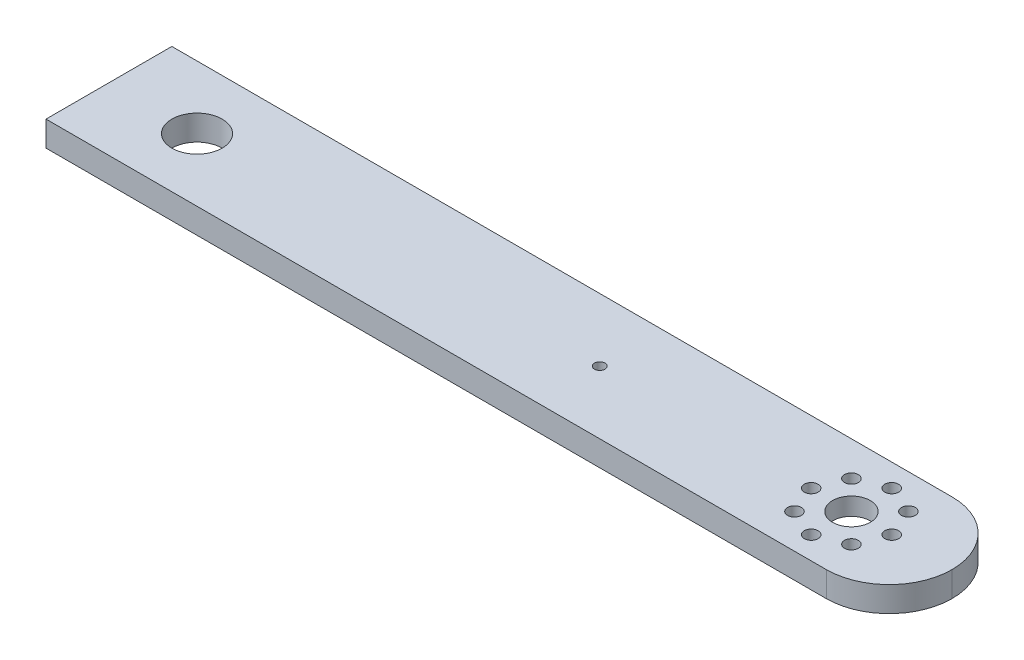
ISO-10303-21;
HEADER;
FILE_DESCRIPTION(('STEP AP214'),'2;1');
FILE_NAME('part.step','',(''),(''),'','','');
FILE_SCHEMA(('AUTOMOTIVE_DESIGN { 1 0 10303 214 1 1 1 1 }'));
ENDSEC;
DATA;
#1=APPLICATION_CONTEXT('core data for automotive mechanical design processes');
#2=APPLICATION_PROTOCOL_DEFINITION('international standard','automotive_design',2000,#1);
#3=PRODUCT_CONTEXT('',#1,'mechanical');
#4=PRODUCT('Part','Part','',(#3));
#5=PRODUCT_RELATED_PRODUCT_CATEGORY('part','',(#4));
#6=PRODUCT_DEFINITION_FORMATION('','',#4);
#7=PRODUCT_DEFINITION_CONTEXT('part definition',#1,'design');
#8=PRODUCT_DEFINITION('design','',#6,#7);
#9=PRODUCT_DEFINITION_SHAPE('','',#8);
#10=(LENGTH_UNIT() NAMED_UNIT(*) SI_UNIT(.MILLI.,.METRE.));
#11=(NAMED_UNIT(*) PLANE_ANGLE_UNIT() SI_UNIT($,.RADIAN.));
#12=(NAMED_UNIT(*) SI_UNIT($,.STERADIAN.) SOLID_ANGLE_UNIT());
#13=UNCERTAINTY_MEASURE_WITH_UNIT(LENGTH_MEASURE(1.E-05),#10,'distance_accuracy_value','');
#14=(GEOMETRIC_REPRESENTATION_CONTEXT(3) GLOBAL_UNCERTAINTY_ASSIGNED_CONTEXT((#13)) GLOBAL_UNIT_ASSIGNED_CONTEXT((#10,
#11,#12)) REPRESENTATION_CONTEXT('',''));
#15=CARTESIAN_POINT('',(0.,0.,0.));
#16=DIRECTION('',(0.,0.,1.));
#17=DIRECTION('',(1.,0.,0.));
#18=AXIS2_PLACEMENT_3D('',#15,#16,#17);
#19=CARTESIAN_POINT('',(0.,5.,0.));
#20=DIRECTION('',(0.,-1.,0.));
#21=DIRECTION('',(0.,0.,-1.));
#22=AXIS2_PLACEMENT_3D('',#19,#20,#21);
#23=CYLINDRICAL_SURFACE('',#22,7.5);
#24=CARTESIAN_POINT('',(0.,5.,0.));
#25=DIRECTION('',(0.,1.,0.));
#26=DIRECTION('',(0.,0.,1.));
#27=AXIS2_PLACEMENT_3D('',#24,#25,#26);
#28=CIRCLE('',#27,7.5);
#29=CARTESIAN_POINT('',(0.,5.,7.5));
#30=VERTEX_POINT('',#29);
#31=EDGE_CURVE('E194',#30,#30,#28,.T.);
#32=ORIENTED_EDGE('',*,*,#31,.T.);
#33=EDGE_LOOP('',(#32));
#34=FACE_BOUND('',#33,.T.);
#35=CARTESIAN_POINT('',(0.,-2.,0.));
#36=DIRECTION('',(0.,-1.,0.));
#37=DIRECTION('',(0.,0.,-1.));
#38=AXIS2_PLACEMENT_3D('',#35,#36,#37);
#39=CIRCLE('',#38,7.5);
#40=CARTESIAN_POINT('',(0.,-2.,-7.5));
#41=VERTEX_POINT('',#40);
#42=EDGE_CURVE('E229',#41,#41,#39,.T.);
#43=ORIENTED_EDGE('',*,*,#42,.T.);
#44=EDGE_LOOP('',(#43));
#45=FACE_BOUND('',#44,.T.);
#46=ADVANCED_FACE('F36',(#34,#45),#23,.F.);
#47=CARTESIAN_POINT('',(-16.,-5.,0.));
#48=DIRECTION('',(0.,1.,0.));
#49=DIRECTION('',(0.,0.,1.));
#50=AXIS2_PLACEMENT_3D('',#47,#48,#49);
#51=CYLINDRICAL_SURFACE('',#50,2.75);
#52=CARTESIAN_POINT('',(-16.,5.,0.));
#53=DIRECTION('',(0.,1.,0.));
#54=DIRECTION('',(0.,0.,1.));
#55=AXIS2_PLACEMENT_3D('',#52,#53,#54);
#56=CIRCLE('',#55,2.75);
#57=CARTESIAN_POINT('',(-16.,5.,2.75));
#58=VERTEX_POINT('',#57);
#59=EDGE_CURVE('E201',#58,#58,#56,.T.);
#60=ORIENTED_EDGE('',*,*,#59,.T.);
#61=EDGE_LOOP('',(#60));
#62=FACE_BOUND('',#61,.T.);
#63=CARTESIAN_POINT('',(-16.,-2.,0.));
#64=DIRECTION('',(0.,-1.,0.));
#65=DIRECTION('',(0.,0.,-1.));
#66=AXIS2_PLACEMENT_3D('',#63,#64,#65);
#67=CIRCLE('',#66,2.75);
#68=CARTESIAN_POINT('',(-16.,-2.,-2.75));
#69=VERTEX_POINT('',#68);
#70=EDGE_CURVE('E234',#69,#69,#67,.F.);
#71=ORIENTED_EDGE('',*,*,#70,.F.);
#72=EDGE_LOOP('',(#71));
#73=FACE_BOUND('',#72,.T.);
#74=ADVANCED_FACE('F143',(#62,#73),#51,.F.);
#75=CARTESIAN_POINT('',(-11.3137084989847,-5.,-11.3137084989848));
#76=DIRECTION('',(0.,1.,0.));
#77=DIRECTION('',(0.,0.,1.));
#78=AXIS2_PLACEMENT_3D('',#75,#76,#77);
#79=CYLINDRICAL_SURFACE('',#78,2.75);
#80=CARTESIAN_POINT('',(-11.3137084989847,5.,-11.3137084989848));
#81=DIRECTION('',(0.,1.,0.));
#82=DIRECTION('',(-0.707106781186549,0.,0.707106781186546));
#83=AXIS2_PLACEMENT_3D('',#80,#81,#82);
#84=CIRCLE('',#83,2.75);
#85=CARTESIAN_POINT('',(-13.2582521472477,5.,-9.36916485072178));
#86=VERTEX_POINT('',#85);
#87=EDGE_CURVE('E206',#86,#86,#84,.T.);
#88=ORIENTED_EDGE('',*,*,#87,.T.);
#89=EDGE_LOOP('',(#88));
#90=FACE_BOUND('',#89,.T.);
#91=CARTESIAN_POINT('',(-11.3137084989847,-2.,-11.3137084989848));
#92=DIRECTION('',(0.,-1.,0.));
#93=DIRECTION('',(0.,0.,-1.));
#94=AXIS2_PLACEMENT_3D('',#91,#92,#93);
#95=CIRCLE('',#94,2.75);
#96=CARTESIAN_POINT('',(-11.3137084989847,-2.,-14.0637084989848));
#97=VERTEX_POINT('',#96);
#98=EDGE_CURVE('E237',#97,#97,#95,.F.);
#99=ORIENTED_EDGE('',*,*,#98,.F.);
#100=EDGE_LOOP('',(#99));
#101=FACE_BOUND('',#100,.T.);
#102=ADVANCED_FACE('F149',(#90,#101),#79,.F.);
#103=CARTESIAN_POINT('',(-11.3137084989849,-5.,11.3137084989846));
#104=DIRECTION('',(0.,1.,0.));
#105=DIRECTION('',(0.,0.,1.));
#106=AXIS2_PLACEMENT_3D('',#103,#104,#105);
#107=CYLINDRICAL_SURFACE('',#106,2.75);
#108=CARTESIAN_POINT('',(-11.3137084989849,5.,11.3137084989846));
#109=DIRECTION('',(0.,1.,0.));
#110=DIRECTION('',(0.707106781186539,0.,0.707106781186556));
#111=AXIS2_PLACEMENT_3D('',#108,#109,#110);
#112=CIRCLE('',#111,2.75);
#113=CARTESIAN_POINT('',(-9.36916485072192,5.,13.2582521472477));
#114=VERTEX_POINT('',#113);
#115=EDGE_CURVE('E122',#114,#114,#112,.T.);
#116=ORIENTED_EDGE('',*,*,#115,.T.);
#117=EDGE_LOOP('',(#116));
#118=FACE_BOUND('',#117,.T.);
#119=CARTESIAN_POINT('',(-11.3137084989849,-2.,11.3137084989846));
#120=DIRECTION('',(0.,-1.,0.));
#121=DIRECTION('',(0.,0.,-1.));
#122=AXIS2_PLACEMENT_3D('',#119,#120,#121);
#123=CIRCLE('',#122,2.75);
#124=CARTESIAN_POINT('',(-11.3137084989849,-2.,8.56370849898462));
#125=VERTEX_POINT('',#124);
#126=EDGE_CURVE('E240',#125,#125,#123,.F.);
#127=ORIENTED_EDGE('',*,*,#126,.F.);
#128=EDGE_LOOP('',(#127));
#129=FACE_BOUND('',#128,.T.);
#130=ADVANCED_FACE('F279',(#118,#129),#107,.F.);
#131=CARTESIAN_POINT('',(-1.6759110426447E-13,-5.,16.));
#132=DIRECTION('',(0.,1.,0.));
#133=DIRECTION('',(0.,0.,1.));
#134=AXIS2_PLACEMENT_3D('',#131,#132,#133);
#135=CYLINDRICAL_SURFACE('',#134,2.75);
#136=CARTESIAN_POINT('',(-1.6759110426447E-13,5.,16.));
#137=DIRECTION('',(0.,1.,0.));
#138=DIRECTION('',(1.,0.,0.));
#139=AXIS2_PLACEMENT_3D('',#136,#137,#138);
#140=CIRCLE('',#139,2.75);
#141=CARTESIAN_POINT('',(2.74999999999983,5.,16.));
#142=VERTEX_POINT('',#141);
#143=EDGE_CURVE('E214',#142,#142,#140,.T.);
#144=ORIENTED_EDGE('',*,*,#143,.T.);
#145=EDGE_LOOP('',(#144));
#146=FACE_BOUND('',#145,.T.);
#147=CARTESIAN_POINT('',(-1.6759110426447E-13,-2.,16.));
#148=DIRECTION('',(0.,-1.,0.));
#149=DIRECTION('',(0.,0.,-1.));
#150=AXIS2_PLACEMENT_3D('',#147,#148,#149);
#151=CIRCLE('',#150,2.75);
#152=CARTESIAN_POINT('',(-1.6759110426447E-13,-2.,13.25));
#153=VERTEX_POINT('',#152);
#154=EDGE_CURVE('E243',#153,#153,#151,.F.);
#155=ORIENTED_EDGE('',*,*,#154,.F.);
#156=EDGE_LOOP('',(#155));
#157=FACE_BOUND('',#156,.T.);
#158=ADVANCED_FACE('F285',(#146,#157),#135,.F.);
#159=CARTESIAN_POINT('',(11.3137084989847,-5.,11.3137084989849));
#160=DIRECTION('',(0.,1.,0.));
#161=DIRECTION('',(0.,0.,1.));
#162=AXIS2_PLACEMENT_3D('',#159,#160,#161);
#163=CYLINDRICAL_SURFACE('',#162,2.75);
#164=CARTESIAN_POINT('',(11.3137084989847,5.,11.3137084989849));
#165=DIRECTION('',(0.,1.,0.));
#166=DIRECTION('',(0.707106781186554,0.,-0.707106781186541));
#167=AXIS2_PLACEMENT_3D('',#164,#165,#166);
#168=CIRCLE('',#167,2.75);
#169=CARTESIAN_POINT('',(13.2582521472477,5.,9.36916485072187));
#170=VERTEX_POINT('',#169);
#171=EDGE_CURVE('E210',#170,#170,#168,.T.);
#172=ORIENTED_EDGE('',*,*,#171,.T.);
#173=EDGE_LOOP('',(#172));
#174=FACE_BOUND('',#173,.T.);
#175=CARTESIAN_POINT('',(11.3137084989847,-2.,11.3137084989849));
#176=DIRECTION('',(0.,-1.,0.));
#177=DIRECTION('',(0.,0.,-1.));
#178=AXIS2_PLACEMENT_3D('',#175,#176,#177);
#179=CIRCLE('',#178,2.75);
#180=CARTESIAN_POINT('',(11.3137084989847,-2.,8.56370849898486));
#181=VERTEX_POINT('',#180);
#182=EDGE_CURVE('E246',#181,#181,#179,.F.);
#183=ORIENTED_EDGE('',*,*,#182,.F.);
#184=EDGE_LOOP('',(#183));
#185=FACE_BOUND('',#184,.T.);
#186=ADVANCED_FACE('F289',(#174,#185),#163,.F.);
#187=CARTESIAN_POINT('',(16.,-5.,0.));
#188=DIRECTION('',(0.,1.,0.));
#189=DIRECTION('',(0.,0.,1.));
#190=AXIS2_PLACEMENT_3D('',#187,#188,#189);
#191=CYLINDRICAL_SURFACE('',#190,2.75);
#192=CARTESIAN_POINT('',(16.,5.,0.));
#193=DIRECTION('',(0.,1.,0.));
#194=DIRECTION('',(0.,0.,-1.));
#195=AXIS2_PLACEMENT_3D('',#192,#193,#194);
#196=CIRCLE('',#195,2.75);
#197=CARTESIAN_POINT('',(16.,5.,-2.75));
#198=VERTEX_POINT('',#197);
#199=EDGE_CURVE('E213',#198,#198,#196,.T.);
#200=ORIENTED_EDGE('',*,*,#199,.T.);
#201=EDGE_LOOP('',(#200));
#202=FACE_BOUND('',#201,.T.);
#203=CARTESIAN_POINT('',(16.,-2.,0.));
#204=DIRECTION('',(0.,-1.,0.));
#205=DIRECTION('',(0.,0.,-1.));
#206=AXIS2_PLACEMENT_3D('',#203,#204,#205);
#207=CIRCLE('',#206,2.75);
#208=CARTESIAN_POINT('',(16.,-2.,-2.75));
#209=VERTEX_POINT('',#208);
#210=EDGE_CURVE('E249',#209,#209,#207,.F.);
#211=ORIENTED_EDGE('',*,*,#210,.F.);
#212=EDGE_LOOP('',(#211));
#213=FACE_BOUND('',#212,.T.);
#214=ADVANCED_FACE('F292',(#202,#213),#191,.F.);
#215=CARTESIAN_POINT('',(11.3137084989848,-5.,-11.3137084989847));
#216=DIRECTION('',(0.,1.,0.));
#217=DIRECTION('',(0.,0.,1.));
#218=AXIS2_PLACEMENT_3D('',#215,#216,#217);
#219=CYLINDRICAL_SURFACE('',#218,2.75);
#220=CARTESIAN_POINT('',(11.3137084989848,5.,-11.3137084989847));
#221=DIRECTION('',(0.,1.,0.));
#222=DIRECTION('',(-0.707106781186544,0.,-0.707106781186551));
#223=AXIS2_PLACEMENT_3D('',#220,#221,#222);
#224=CIRCLE('',#223,2.75);
#225=CARTESIAN_POINT('',(9.36916485072183,5.,-13.2582521472477));
#226=VERTEX_POINT('',#225);
#227=EDGE_CURVE('E217',#226,#226,#224,.T.);
#228=ORIENTED_EDGE('',*,*,#227,.T.);
#229=EDGE_LOOP('',(#228));
#230=FACE_BOUND('',#229,.T.);
#231=CARTESIAN_POINT('',(11.3137084989848,-2.,-11.3137084989847));
#232=DIRECTION('',(0.,-1.,0.));
#233=DIRECTION('',(0.,0.,-1.));
#234=AXIS2_PLACEMENT_3D('',#231,#232,#233);
#235=CIRCLE('',#234,2.75);
#236=CARTESIAN_POINT('',(11.3137084989848,-2.,-14.0637084989847));
#237=VERTEX_POINT('',#236);
#238=EDGE_CURVE('E126',#237,#237,#235,.F.);
#239=ORIENTED_EDGE('',*,*,#238,.F.);
#240=EDGE_LOOP('',(#239));
#241=FACE_BOUND('',#240,.T.);
#242=ADVANCED_FACE('F296',(#230,#241),#219,.F.);
#243=CARTESIAN_POINT('',(0.,-5.,-16.));
#244=DIRECTION('',(0.,1.,0.));
#245=DIRECTION('',(0.,0.,1.));
#246=AXIS2_PLACEMENT_3D('',#243,#244,#245);
#247=CYLINDRICAL_SURFACE('',#246,2.75);
#248=CARTESIAN_POINT('',(0.,5.,-16.));
#249=DIRECTION('',(0.,1.,0.));
#250=DIRECTION('',(-1.,0.,0.));
#251=AXIS2_PLACEMENT_3D('',#248,#249,#250);
#252=CIRCLE('',#251,2.75);
#253=CARTESIAN_POINT('',(-2.74999999999994,5.,-16.));
#254=VERTEX_POINT('',#253);
#255=EDGE_CURVE('E209',#254,#254,#252,.T.);
#256=ORIENTED_EDGE('',*,*,#255,.T.);
#257=EDGE_LOOP('',(#256));
#258=FACE_BOUND('',#257,.T.);
#259=CARTESIAN_POINT('',(0.,-2.,-16.));
#260=DIRECTION('',(0.,-1.,0.));
#261=DIRECTION('',(0.,0.,-1.));
#262=AXIS2_PLACEMENT_3D('',#259,#260,#261);
#263=CIRCLE('',#262,2.75);
#264=CARTESIAN_POINT('',(0.,-2.,-18.75));
#265=VERTEX_POINT('',#264);
#266=EDGE_CURVE('E124',#265,#265,#263,.F.);
#267=ORIENTED_EDGE('',*,*,#266,.F.);
#268=EDGE_LOOP('',(#267));
#269=FACE_BOUND('',#268,.T.);
#270=ADVANCED_FACE('F160',(#258,#269),#247,.F.);
#271=CARTESIAN_POINT('',(0.,5.,0.));
#272=DIRECTION('',(0.,1.,0.));
#273=DIRECTION('',(0.,0.,1.));
#274=AXIS2_PLACEMENT_3D('',#271,#272,#273);
#275=PLANE('',#274);
#276=CARTESIAN_POINT('',(-100.,5.,0.));
#277=DIRECTION('',(0.,1.,0.));
#278=DIRECTION('',(0.,0.,1.));
#279=AXIS2_PLACEMENT_3D('',#276,#277,#278);
#280=CIRCLE('',#279,2.1);
#281=CARTESIAN_POINT('',(-100.,5.,2.10000000000002));
#282=VERTEX_POINT('',#281);
#283=EDGE_CURVE('E226',#282,#282,#280,.T.);
#284=ORIENTED_EDGE('',*,*,#283,.F.);
#285=EDGE_LOOP('',(#284));
#286=FACE_BOUND('',#285,.T.);
#287=ORIENTED_EDGE('',*,*,#255,.F.);
#288=EDGE_LOOP('',(#287));
#289=FACE_BOUND('',#288,.T.);
#290=ORIENTED_EDGE('',*,*,#227,.F.);
#291=EDGE_LOOP('',(#290));
#292=FACE_BOUND('',#291,.T.);
#293=ORIENTED_EDGE('',*,*,#199,.F.);
#294=EDGE_LOOP('',(#293));
#295=FACE_BOUND('',#294,.T.);
#296=ORIENTED_EDGE('',*,*,#171,.F.);
#297=EDGE_LOOP('',(#296));
#298=FACE_BOUND('',#297,.T.);
#299=ORIENTED_EDGE('',*,*,#143,.F.);
#300=EDGE_LOOP('',(#299));
#301=FACE_BOUND('',#300,.T.);
#302=ORIENTED_EDGE('',*,*,#115,.F.);
#303=EDGE_LOOP('',(#302));
#304=FACE_BOUND('',#303,.T.);
#305=ORIENTED_EDGE('',*,*,#87,.F.);
#306=EDGE_LOOP('',(#305));
#307=FACE_BOUND('',#306,.T.);
#308=ORIENTED_EDGE('',*,*,#59,.F.);
#309=EDGE_LOOP('',(#308));
#310=FACE_BOUND('',#309,.T.);
#311=ORIENTED_EDGE('',*,*,#31,.F.);
#312=EDGE_LOOP('',(#311));
#313=FACE_BOUND('',#312,.T.);
#314=DIRECTION('',(1.,0.,0.));
#315=VECTOR('',#314,1.);
#316=CARTESIAN_POINT('',(-295.,5.,25.));
#317=LINE('',#316,#315);
#318=CARTESIAN_POINT('',(-295.,5.,25.));
#319=VERTEX_POINT('',#318);
#320=CARTESIAN_POINT('',(15.,5.,25.));
#321=VERTEX_POINT('',#320);
#322=EDGE_CURVE('E82',#319,#321,#317,.T.);
#323=ORIENTED_EDGE('',*,*,#322,.T.);
#324=CARTESIAN_POINT('',(15.,5.,0.));
#325=DIRECTION('',(0.,1.,0.));
#326=DIRECTION('',(0.,0.,1.));
#327=AXIS2_PLACEMENT_3D('',#324,#325,#326);
#328=CIRCLE('',#327,25.);
#329=CARTESIAN_POINT('',(40.,5.,0.));
#330=VERTEX_POINT('',#329);
#331=EDGE_CURVE('E57',#321,#330,#328,.T.);
#332=ORIENTED_EDGE('',*,*,#331,.T.);
#333=CARTESIAN_POINT('',(15.,5.,0.));
#334=DIRECTION('',(0.,1.,0.));
#335=DIRECTION('',(0.,0.,1.));
#336=AXIS2_PLACEMENT_3D('',#333,#334,#335);
#337=CIRCLE('',#336,25.);
#338=CARTESIAN_POINT('',(15.,5.,-25.));
#339=VERTEX_POINT('',#338);
#340=EDGE_CURVE('E52',#330,#339,#337,.T.);
#341=ORIENTED_EDGE('',*,*,#340,.T.);
#342=DIRECTION('',(-1.,0.,0.));
#343=VECTOR('',#342,1.);
#344=CARTESIAN_POINT('',(-295.,5.,-24.9999999999998));
#345=LINE('',#344,#343);
#346=CARTESIAN_POINT('',(-295.,5.,-24.9999999999998));
#347=VERTEX_POINT('',#346);
#348=EDGE_CURVE('E91',#339,#347,#345,.T.);
#349=ORIENTED_EDGE('',*,*,#348,.T.);
#350=DIRECTION('',(0.,0.,1.));
#351=VECTOR('',#350,1.);
#352=CARTESIAN_POINT('',(-295.,5.,-24.9999999999998));
#353=LINE('',#352,#351);
#354=EDGE_CURVE('E92',#347,#319,#353,.T.);
#355=ORIENTED_EDGE('',*,*,#354,.T.);
#356=EDGE_LOOP('',(#323,#332,#341,#349,#355));
#357=FACE_BOUND('',#356,.T.);
#358=CARTESIAN_POINT('',(-260.,5.,0.));
#359=DIRECTION('',(0.,1.,0.));
#360=DIRECTION('',(0.,0.,1.));
#361=AXIS2_PLACEMENT_3D('',#358,#359,#360);
#362=CIRCLE('',#361,9.99999999999998);
#363=CARTESIAN_POINT('',(-260.,5.,9.99999999999998));
#364=VERTEX_POINT('',#363);
#365=EDGE_CURVE('E197',#364,#364,#362,.T.);
#366=ORIENTED_EDGE('',*,*,#365,.F.);
#367=EDGE_LOOP('',(#366));
#368=FACE_BOUND('',#367,.T.);
#369=ADVANCED_FACE('F95',(#286,#289,#292,#295,#298,#301,#304,#307,#310,#313,#357,#368),#275,.T.);
#370=CARTESIAN_POINT('',(0.,-5.,0.));
#371=DIRECTION('',(0.,1.,0.));
#372=DIRECTION('',(0.,0.,1.));
#373=AXIS2_PLACEMENT_3D('',#370,#371,#372);
#374=PLANE('',#373);
#375=CARTESIAN_POINT('',(0.,-5.,0.));
#376=DIRECTION('',(0.,1.,0.));
#377=DIRECTION('',(0.,0.,1.));
#378=AXIS2_PLACEMENT_3D('',#375,#376,#377);
#379=CIRCLE('',#378,21.5);
#380=CARTESIAN_POINT('',(0.,-5.,21.5));
#381=VERTEX_POINT('',#380);
#382=EDGE_CURVE('E11',#381,#381,#379,.T.);
#383=ORIENTED_EDGE('',*,*,#382,.T.);
#384=EDGE_LOOP('',(#383));
#385=FACE_BOUND('',#384,.T.);
#386=CARTESIAN_POINT('',(-100.,-5.,0.));
#387=DIRECTION('',(0.,1.,0.));
#388=DIRECTION('',(0.,0.,1.));
#389=AXIS2_PLACEMENT_3D('',#386,#387,#388);
#390=CIRCLE('',#389,2.1);
#391=CARTESIAN_POINT('',(-100.,-5.,2.10000000000002));
#392=VERTEX_POINT('',#391);
#393=EDGE_CURVE('E123',#392,#392,#390,.T.);
#394=ORIENTED_EDGE('',*,*,#393,.T.);
#395=EDGE_LOOP('',(#394));
#396=FACE_BOUND('',#395,.T.);
#397=CARTESIAN_POINT('',(15.,-5.,0.));
#398=DIRECTION('',(0.,1.,0.));
#399=DIRECTION('',(0.,0.,1.));
#400=AXIS2_PLACEMENT_3D('',#397,#398,#399);
#401=CIRCLE('',#400,25.);
#402=CARTESIAN_POINT('',(15.,-5.,-25.));
#403=VERTEX_POINT('',#402);
#404=CARTESIAN_POINT('',(40.,-5.,0.));
#405=VERTEX_POINT('',#404);
#406=EDGE_CURVE('E105',#403,#405,#401,.F.);
#407=ORIENTED_EDGE('',*,*,#406,.T.);
#408=CARTESIAN_POINT('',(15.,-5.,0.));
#409=DIRECTION('',(0.,1.,0.));
#410=DIRECTION('',(0.,0.,1.));
#411=AXIS2_PLACEMENT_3D('',#408,#409,#410);
#412=CIRCLE('',#411,25.);
#413=CARTESIAN_POINT('',(15.,-5.,25.));
#414=VERTEX_POINT('',#413);
#415=EDGE_CURVE('E108',#405,#414,#412,.F.);
#416=ORIENTED_EDGE('',*,*,#415,.T.);
#417=DIRECTION('',(1.,0.,0.));
#418=VECTOR('',#417,1.);
#419=CARTESIAN_POINT('',(-295.,-5.,25.));
#420=LINE('',#419,#418);
#421=CARTESIAN_POINT('',(-295.,-5.,25.));
#422=VERTEX_POINT('',#421);
#423=EDGE_CURVE('E190',#422,#414,#420,.T.);
#424=ORIENTED_EDGE('',*,*,#423,.F.);
#425=DIRECTION('',(0.,0.,1.));
#426=VECTOR('',#425,1.);
#427=CARTESIAN_POINT('',(-295.,-5.,-24.9999999999998));
#428=LINE('',#427,#426);
#429=CARTESIAN_POINT('',(-295.,-5.,-24.9999999999998));
#430=VERTEX_POINT('',#429);
#431=EDGE_CURVE('E104',#430,#422,#428,.T.);
#432=ORIENTED_EDGE('',*,*,#431,.F.);
#433=DIRECTION('',(-1.,0.,0.));
#434=VECTOR('',#433,1.);
#435=CARTESIAN_POINT('',(-295.,-5.,-24.9999999999998));
#436=LINE('',#435,#434);
#437=EDGE_CURVE('E100',#403,#430,#436,.T.);
#438=ORIENTED_EDGE('',*,*,#437,.F.);
#439=EDGE_LOOP('',(#407,#416,#424,#432,#438));
#440=FACE_BOUND('',#439,.T.);
#441=CARTESIAN_POINT('',(-260.,-5.,0.));
#442=DIRECTION('',(0.,1.,0.));
#443=DIRECTION('',(0.,0.,1.));
#444=AXIS2_PLACEMENT_3D('',#441,#442,#443);
#445=CIRCLE('',#444,9.99999999999998);
#446=CARTESIAN_POINT('',(-260.,-5.,9.99999999999998));
#447=VERTEX_POINT('',#446);
#448=EDGE_CURVE('E198',#447,#447,#445,.T.);
#449=ORIENTED_EDGE('',*,*,#448,.T.);
#450=EDGE_LOOP('',(#449));
#451=FACE_BOUND('',#450,.T.);
#452=ADVANCED_FACE('F159',(#385,#396,#440,#451),#374,.F.);
#453=CARTESIAN_POINT('',(-295.,5.,-24.9999999999998));
#454=DIRECTION('',(1.,0.,0.));
#455=DIRECTION('',(0.,0.,-1.));
#456=AXIS2_PLACEMENT_3D('',#453,#454,#455);
#457=PLANE('',#456);
#458=ORIENTED_EDGE('',*,*,#431,.T.);
#459=DIRECTION('',(0.,-1.,0.));
#460=VECTOR('',#459,1.);
#461=CARTESIAN_POINT('',(-295.,5.,25.));
#462=LINE('',#461,#460);
#463=EDGE_CURVE('E87',#319,#422,#462,.T.);
#464=ORIENTED_EDGE('',*,*,#463,.F.);
#465=ORIENTED_EDGE('',*,*,#354,.F.);
#466=DIRECTION('',(0.,-1.,0.));
#467=VECTOR('',#466,1.);
#468=CARTESIAN_POINT('',(-295.,5.,-24.9999999999998));
#469=LINE('',#468,#467);
#470=EDGE_CURVE('E106',#347,#430,#469,.T.);
#471=ORIENTED_EDGE('',*,*,#470,.T.);
#472=EDGE_LOOP('',(#458,#464,#465,#471));
#473=FACE_BOUND('',#472,.T.);
#474=ADVANCED_FACE('F102',(#473),#457,.F.);
#475=CARTESIAN_POINT('',(-295.,5.,25.));
#476=DIRECTION('',(0.,0.,-1.));
#477=DIRECTION('',(-1.,0.,0.));
#478=AXIS2_PLACEMENT_3D('',#475,#476,#477);
#479=PLANE('',#478);
#480=ORIENTED_EDGE('',*,*,#423,.T.);
#481=DIRECTION('',(0.,-1.,0.));
#482=VECTOR('',#481,1.);
#483=CARTESIAN_POINT('',(15.,5.,25.));
#484=LINE('',#483,#482);
#485=EDGE_CURVE('E90',#414,#321,#484,.F.);
#486=ORIENTED_EDGE('',*,*,#485,.T.);
#487=ORIENTED_EDGE('',*,*,#322,.F.);
#488=ORIENTED_EDGE('',*,*,#463,.T.);
#489=EDGE_LOOP('',(#480,#486,#487,#488));
#490=FACE_BOUND('',#489,.T.);
#491=ADVANCED_FACE('F85',(#490),#479,.F.);
#492=CARTESIAN_POINT('',(-295.,5.,-24.9999999999998));
#493=DIRECTION('',(0.,0.,1.));
#494=DIRECTION('',(1.,0.,0.));
#495=AXIS2_PLACEMENT_3D('',#492,#493,#494);
#496=PLANE('',#495);
#497=ORIENTED_EDGE('',*,*,#348,.F.);
#498=DIRECTION('',(0.,-1.,0.));
#499=VECTOR('',#498,1.);
#500=CARTESIAN_POINT('',(15.,5.,-25.));
#501=LINE('',#500,#499);
#502=EDGE_CURVE('E117',#339,#403,#501,.T.);
#503=ORIENTED_EDGE('',*,*,#502,.T.);
#504=ORIENTED_EDGE('',*,*,#437,.T.);
#505=ORIENTED_EDGE('',*,*,#470,.F.);
#506=EDGE_LOOP('',(#497,#503,#504,#505));
#507=FACE_BOUND('',#506,.T.);
#508=ADVANCED_FACE('F165',(#507),#496,.F.);
#509=CARTESIAN_POINT('',(-260.,5.,0.));
#510=DIRECTION('',(0.,-1.,0.));
#511=DIRECTION('',(0.,0.,-1.));
#512=AXIS2_PLACEMENT_3D('',#509,#510,#511);
#513=CYLINDRICAL_SURFACE('',#512,9.99999999999998);
#514=ORIENTED_EDGE('',*,*,#365,.T.);
#515=EDGE_LOOP('',(#514));
#516=FACE_BOUND('',#515,.T.);
#517=ORIENTED_EDGE('',*,*,#448,.F.);
#518=EDGE_LOOP('',(#517));
#519=FACE_BOUND('',#518,.T.);
#520=ADVANCED_FACE('F156',(#516,#519),#513,.F.);
#521=CARTESIAN_POINT('',(15.,5.,0.));
#522=DIRECTION('',(0.,-1.,0.));
#523=DIRECTION('',(0.,0.,-1.));
#524=AXIS2_PLACEMENT_3D('',#521,#522,#523);
#525=CYLINDRICAL_SURFACE('',#524,25.);
#526=ORIENTED_EDGE('',*,*,#502,.F.);
#527=ORIENTED_EDGE('',*,*,#340,.F.);
#528=DIRECTION('',(0.,-1.,0.));
#529=VECTOR('',#528,1.);
#530=CARTESIAN_POINT('',(40.,5.,0.));
#531=LINE('',#530,#529);
#532=EDGE_CURVE('E119',#405,#330,#531,.F.);
#533=ORIENTED_EDGE('',*,*,#532,.F.);
#534=ORIENTED_EDGE('',*,*,#406,.F.);
#535=EDGE_LOOP('',(#526,#527,#533,#534));
#536=FACE_BOUND('',#535,.T.);
#537=ADVANCED_FACE('F176',(#536),#525,.T.);
#538=CARTESIAN_POINT('',(15.,5.,0.));
#539=DIRECTION('',(0.,-1.,0.));
#540=DIRECTION('',(0.,0.,-1.));
#541=AXIS2_PLACEMENT_3D('',#538,#539,#540);
#542=CYLINDRICAL_SURFACE('',#541,25.);
#543=ORIENTED_EDGE('',*,*,#331,.F.);
#544=ORIENTED_EDGE('',*,*,#485,.F.);
#545=ORIENTED_EDGE('',*,*,#415,.F.);
#546=ORIENTED_EDGE('',*,*,#532,.T.);
#547=EDGE_LOOP('',(#543,#544,#545,#546));
#548=FACE_BOUND('',#547,.T.);
#549=ADVANCED_FACE('F173',(#548),#542,.T.);
#550=CARTESIAN_POINT('',(-100.,-5.,0.));
#551=DIRECTION('',(0.,1.,0.));
#552=DIRECTION('',(0.,0.,1.));
#553=AXIS2_PLACEMENT_3D('',#550,#551,#552);
#554=CYLINDRICAL_SURFACE('',#553,2.1);
#555=ORIENTED_EDGE('',*,*,#393,.F.);
#556=EDGE_LOOP('',(#555));
#557=FACE_BOUND('',#556,.T.);
#558=ORIENTED_EDGE('',*,*,#283,.T.);
#559=EDGE_LOOP('',(#558));
#560=FACE_BOUND('',#559,.T.);
#561=ADVANCED_FACE('F175',(#557,#560),#554,.F.);
#562=CARTESIAN_POINT('',(0.,-2.,0.));
#563=DIRECTION('',(0.,-1.,0.));
#564=DIRECTION('',(0.,0.,-1.));
#565=AXIS2_PLACEMENT_3D('',#562,#563,#564);
#566=PLANE('',#565);
#567=ORIENTED_EDGE('',*,*,#42,.F.);
#568=EDGE_LOOP('',(#567));
#569=FACE_BOUND('',#568,.T.);
#570=CARTESIAN_POINT('',(0.,-2.,0.));
#571=DIRECTION('',(0.,-1.,0.));
#572=DIRECTION('',(0.,0.,-1.));
#573=AXIS2_PLACEMENT_3D('',#570,#571,#572);
#574=CIRCLE('',#573,21.);
#575=CARTESIAN_POINT('',(0.,-2.,-21.));
#576=VERTEX_POINT('',#575);
#577=EDGE_CURVE('E127',#576,#576,#574,.T.);
#578=ORIENTED_EDGE('',*,*,#577,.T.);
#579=EDGE_LOOP('',(#578));
#580=FACE_BOUND('',#579,.T.);
#581=ORIENTED_EDGE('',*,*,#266,.T.);
#582=EDGE_LOOP('',(#581));
#583=FACE_BOUND('',#582,.T.);
#584=ORIENTED_EDGE('',*,*,#238,.T.);
#585=EDGE_LOOP('',(#584));
#586=FACE_BOUND('',#585,.T.);
#587=ORIENTED_EDGE('',*,*,#210,.T.);
#588=EDGE_LOOP('',(#587));
#589=FACE_BOUND('',#588,.T.);
#590=ORIENTED_EDGE('',*,*,#182,.T.);
#591=EDGE_LOOP('',(#590));
#592=FACE_BOUND('',#591,.T.);
#593=ORIENTED_EDGE('',*,*,#154,.T.);
#594=EDGE_LOOP('',(#593));
#595=FACE_BOUND('',#594,.T.);
#596=ORIENTED_EDGE('',*,*,#126,.T.);
#597=EDGE_LOOP('',(#596));
#598=FACE_BOUND('',#597,.T.);
#599=ORIENTED_EDGE('',*,*,#98,.T.);
#600=EDGE_LOOP('',(#599));
#601=FACE_BOUND('',#600,.T.);
#602=ORIENTED_EDGE('',*,*,#70,.T.);
#603=EDGE_LOOP('',(#602));
#604=FACE_BOUND('',#603,.T.);
#605=ADVANCED_FACE('F139',(#569,#580,#583,#586,#589,#592,#595,#598,#601,#604),#566,.T.);
#606=CARTESIAN_POINT('',(0.,-2.,0.));
#607=DIRECTION('',(0.,-1.,0.));
#608=DIRECTION('',(0.,0.,-1.));
#609=AXIS2_PLACEMENT_3D('',#606,#607,#608);
#610=CYLINDRICAL_SURFACE('',#609,21.);
#611=CARTESIAN_POINT('',(0.,-4.50000000000002,0.));
#612=DIRECTION('',(0.,1.,0.));
#613=DIRECTION('',(0.,0.,1.));
#614=AXIS2_PLACEMENT_3D('',#611,#612,#613);
#615=CIRCLE('',#614,21.);
#616=CARTESIAN_POINT('',(0.,-4.50000000000002,21.));
#617=VERTEX_POINT('',#616);
#618=EDGE_CURVE('E45',#617,#617,#615,.F.);
#619=ORIENTED_EDGE('',*,*,#618,.T.);
#620=EDGE_LOOP('',(#619));
#621=FACE_BOUND('',#620,.T.);
#622=ORIENTED_EDGE('',*,*,#577,.F.);
#623=EDGE_LOOP('',(#622));
#624=FACE_BOUND('',#623,.T.);
#625=ADVANCED_FACE('F131',(#621,#624),#610,.F.);
#626=CARTESIAN_POINT('',(0.,-4.50000000000002,0.));
#627=DIRECTION('',(0.,-1.,0.));
#628=DIRECTION('',(0.,0.,-1.));
#629=AXIS2_PLACEMENT_3D('',#626,#627,#628);
#630=CONICAL_SURFACE('',#629,21.,0.785398163397455);
#631=ORIENTED_EDGE('',*,*,#382,.F.);
#632=EDGE_LOOP('',(#631));
#633=FACE_BOUND('',#632,.T.);
#634=ORIENTED_EDGE('',*,*,#618,.F.);
#635=EDGE_LOOP('',(#634));
#636=FACE_BOUND('',#635,.T.);
#637=ADVANCED_FACE('F39',(#633,#636),#630,.F.);
#638=CLOSED_SHELL('',(#46,#74,#102,#130,#158,#186,#214,#242,#270,#369,#452,#474,#491,#508,#520,
#537,#549,#561,#605,#625,#637));
#639=MANIFOLD_SOLID_BREP('B2',#638);
#640=ADVANCED_BREP_SHAPE_REPRESENTATION('',(#18,#639),#14);
#641=SHAPE_DEFINITION_REPRESENTATION(#9,#640);
ENDSEC;
END-ISO-10303-21;
